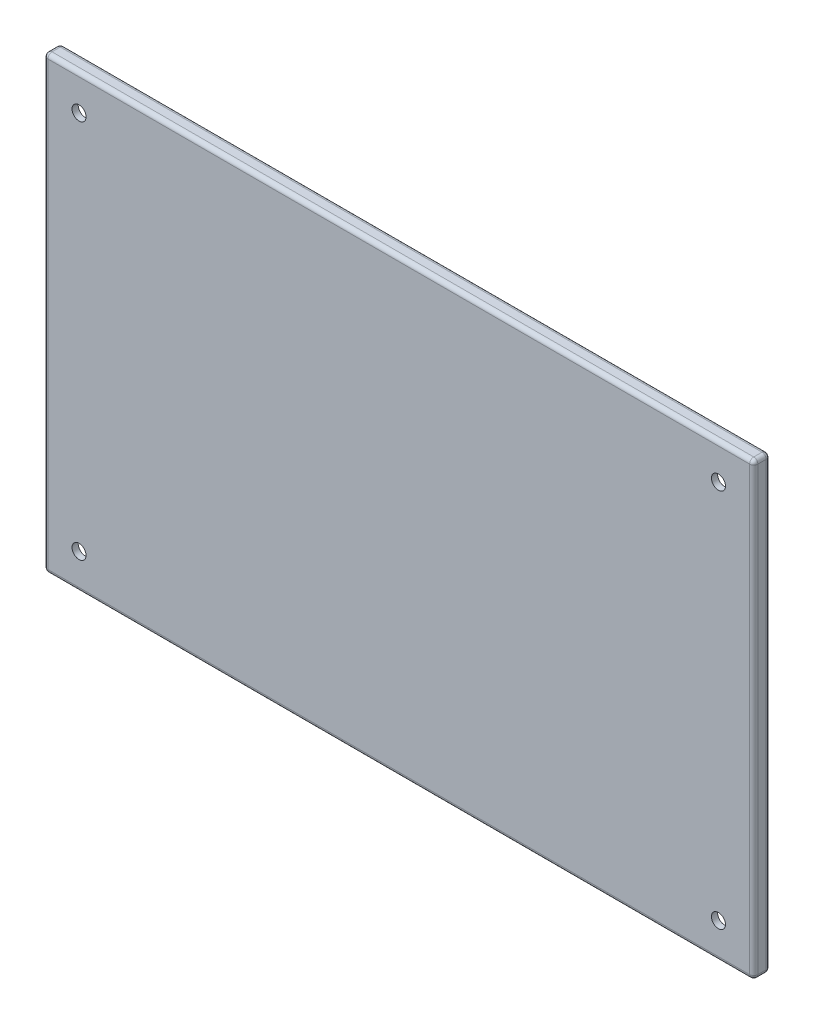
ISO-10303-21;
HEADER;
FILE_DESCRIPTION(('STEP AP214'),'2;1');
FILE_NAME('part.step','',(''),(''),'','','');
FILE_SCHEMA(('AUTOMOTIVE_DESIGN { 1 0 10303 214 1 1 1 1 }'));
ENDSEC;
DATA;
#1=APPLICATION_CONTEXT('core data for automotive mechanical design processes');
#2=APPLICATION_PROTOCOL_DEFINITION('international standard','automotive_design',2000,#1);
#3=PRODUCT_CONTEXT('',#1,'mechanical');
#4=PRODUCT('Part','Part','',(#3));
#5=PRODUCT_RELATED_PRODUCT_CATEGORY('part','',(#4));
#6=PRODUCT_DEFINITION_FORMATION('','',#4);
#7=PRODUCT_DEFINITION_CONTEXT('part definition',#1,'design');
#8=PRODUCT_DEFINITION('design','',#6,#7);
#9=PRODUCT_DEFINITION_SHAPE('','',#8);
#10=(LENGTH_UNIT() NAMED_UNIT(*) SI_UNIT(.MILLI.,.METRE.));
#11=(NAMED_UNIT(*) PLANE_ANGLE_UNIT() SI_UNIT($,.RADIAN.));
#12=(NAMED_UNIT(*) SI_UNIT($,.STERADIAN.) SOLID_ANGLE_UNIT());
#13=UNCERTAINTY_MEASURE_WITH_UNIT(LENGTH_MEASURE(1.E-05),#10,'distance_accuracy_value','');
#14=(GEOMETRIC_REPRESENTATION_CONTEXT(3) GLOBAL_UNCERTAINTY_ASSIGNED_CONTEXT((#13)) GLOBAL_UNIT_ASSIGNED_CONTEXT((#10,
#11,#12)) REPRESENTATION_CONTEXT('',''));
#15=CARTESIAN_POINT('',(0.,0.,0.));
#16=DIRECTION('',(0.,0.,1.));
#17=DIRECTION('',(1.,0.,0.));
#18=AXIS2_PLACEMENT_3D('',#15,#16,#17);
#19=CARTESIAN_POINT('',(0.,0.,1.5));
#20=DIRECTION('',(0.,0.,1.));
#21=DIRECTION('',(1.,0.,0.));
#22=AXIS2_PLACEMENT_3D('',#19,#20,#21);
#23=PLANE('',#22);
#24=DIRECTION('',(-1.,0.,0.));
#25=VECTOR('',#24,1.);
#26=CARTESIAN_POINT('',(0.,53.55,1.5));
#27=LINE('',#26,#25);
#28=CARTESIAN_POINT('',(85.,53.55,1.5));
#29=VERTEX_POINT('',#28);
#30=CARTESIAN_POINT('',(-85.,53.55,1.5));
#31=VERTEX_POINT('',#30);
#32=EDGE_CURVE('E275',#29,#31,#27,.T.);
#33=ORIENTED_EDGE('',*,*,#32,.T.);
#34=DIRECTION('',(0.,-1.,0.));
#35=VECTOR('',#34,1.);
#36=CARTESIAN_POINT('',(-85.,0.,1.5));
#37=LINE('',#36,#35);
#38=CARTESIAN_POINT('',(-85.,-53.55,1.5));
#39=VERTEX_POINT('',#38);
#40=EDGE_CURVE('E284',#31,#39,#37,.T.);
#41=ORIENTED_EDGE('',*,*,#40,.T.);
#42=DIRECTION('',(1.,0.,0.));
#43=VECTOR('',#42,1.);
#44=CARTESIAN_POINT('',(0.,-53.55,1.5));
#45=LINE('',#44,#43);
#46=CARTESIAN_POINT('',(85.,-53.55,1.5));
#47=VERTEX_POINT('',#46);
#48=EDGE_CURVE('E281',#39,#47,#45,.T.);
#49=ORIENTED_EDGE('',*,*,#48,.T.);
#50=DIRECTION('',(0.,1.,0.));
#51=VECTOR('',#50,1.);
#52=CARTESIAN_POINT('',(85.,0.,1.5));
#53=LINE('',#52,#51);
#54=EDGE_CURVE('E278',#47,#29,#53,.T.);
#55=ORIENTED_EDGE('',*,*,#54,.T.);
#56=EDGE_LOOP('',(#33,#41,#49,#55));
#57=FACE_BOUND('',#56,.T.);
#58=CARTESIAN_POINT('',(77.45,-46.,1.5));
#59=DIRECTION('',(0.,0.,1.));
#60=DIRECTION('',(1.,0.,0.));
#61=AXIS2_PLACEMENT_3D('',#58,#59,#60);
#62=CIRCLE('',#61,1.7);
#63=CARTESIAN_POINT('',(79.15,-46.,1.5));
#64=VERTEX_POINT('',#63);
#65=EDGE_CURVE('E216',#64,#64,#62,.T.);
#66=ORIENTED_EDGE('',*,*,#65,.F.);
#67=EDGE_LOOP('',(#66));
#68=FACE_BOUND('',#67,.T.);
#69=CARTESIAN_POINT('',(-77.45,46.,1.5));
#70=DIRECTION('',(0.,0.,1.));
#71=DIRECTION('',(1.,0.,0.));
#72=AXIS2_PLACEMENT_3D('',#69,#70,#71);
#73=CIRCLE('',#72,1.7);
#74=CARTESIAN_POINT('',(-75.75,46.,1.5));
#75=VERTEX_POINT('',#74);
#76=EDGE_CURVE('E232',#75,#75,#73,.T.);
#77=ORIENTED_EDGE('',*,*,#76,.F.);
#78=EDGE_LOOP('',(#77));
#79=FACE_BOUND('',#78,.T.);
#80=CARTESIAN_POINT('',(77.45,46.,1.5));
#81=DIRECTION('',(0.,0.,1.));
#82=DIRECTION('',(-1.,0.,0.));
#83=AXIS2_PLACEMENT_3D('',#80,#81,#82);
#84=CIRCLE('',#83,1.7);
#85=CARTESIAN_POINT('',(75.75,46.,1.5));
#86=VERTEX_POINT('',#85);
#87=EDGE_CURVE('E224',#86,#86,#84,.T.);
#88=ORIENTED_EDGE('',*,*,#87,.F.);
#89=EDGE_LOOP('',(#88));
#90=FACE_BOUND('',#89,.T.);
#91=CARTESIAN_POINT('',(-77.45,-46.,1.5));
#92=DIRECTION('',(0.,0.,1.));
#93=DIRECTION('',(-1.,0.,0.));
#94=AXIS2_PLACEMENT_3D('',#91,#92,#93);
#95=CIRCLE('',#94,1.7);
#96=CARTESIAN_POINT('',(-79.15,-46.,1.5));
#97=VERTEX_POINT('',#96);
#98=EDGE_CURVE('E208',#97,#97,#95,.T.);
#99=ORIENTED_EDGE('',*,*,#98,.F.);
#100=EDGE_LOOP('',(#99));
#101=FACE_BOUND('',#100,.T.);
#102=ADVANCED_FACE('F45',(#57,#68,#79,#90,#101),#23,.T.);
#103=CARTESIAN_POINT('',(0.,0.,0.));
#104=DIRECTION('',(0.,0.,1.));
#105=DIRECTION('',(1.,0.,0.));
#106=AXIS2_PLACEMENT_3D('',#103,#104,#105);
#107=PLANE('',#106);
#108=DIRECTION('',(0.,-1.,0.));
#109=VECTOR('',#108,1.);
#110=CARTESIAN_POINT('',(-82.5,-51.05,0.));
#111=LINE('',#110,#109);
#112=CARTESIAN_POINT('',(-82.5,52.05,0.));
#113=VERTEX_POINT('',#112);
#114=CARTESIAN_POINT('',(-82.5,-51.05,0.));
#115=VERTEX_POINT('',#114);
#116=EDGE_CURVE('E236',#113,#115,#111,.T.);
#117=ORIENTED_EDGE('',*,*,#116,.F.);
#118=DIRECTION('',(1.,0.,0.));
#119=VECTOR('',#118,1.);
#120=CARTESIAN_POINT('',(82.5,52.05,0.));
#121=LINE('',#120,#119);
#122=CARTESIAN_POINT('',(82.5,52.05,0.));
#123=VERTEX_POINT('',#122);
#124=EDGE_CURVE('E182',#113,#123,#121,.T.);
#125=ORIENTED_EDGE('',*,*,#124,.T.);
#126=DIRECTION('',(0.,1.,0.));
#127=VECTOR('',#126,1.);
#128=CARTESIAN_POINT('',(82.5,-51.05,0.));
#129=LINE('',#128,#127);
#130=CARTESIAN_POINT('',(82.5,-51.05,0.));
#131=VERTEX_POINT('',#130);
#132=EDGE_CURVE('E246',#131,#123,#129,.T.);
#133=ORIENTED_EDGE('',*,*,#132,.F.);
#134=DIRECTION('',(1.,0.,0.));
#135=VECTOR('',#134,1.);
#136=CARTESIAN_POINT('',(82.5,-51.05,0.));
#137=LINE('',#136,#135);
#138=EDGE_CURVE('E242',#115,#131,#137,.T.);
#139=ORIENTED_EDGE('',*,*,#138,.F.);
#140=EDGE_LOOP('',(#117,#125,#133,#139));
#141=FACE_BOUND('',#140,.T.);
#142=CARTESIAN_POINT('',(-77.45,46.,0.));
#143=DIRECTION('',(0.,0.,1.));
#144=DIRECTION('',(1.,0.,0.));
#145=AXIS2_PLACEMENT_3D('',#142,#143,#144);
#146=CIRCLE('',#145,1.7);
#147=CARTESIAN_POINT('',(-75.75,46.,0.));
#148=VERTEX_POINT('',#147);
#149=EDGE_CURVE('E228',#148,#148,#146,.T.);
#150=ORIENTED_EDGE('',*,*,#149,.T.);
#151=EDGE_LOOP('',(#150));
#152=FACE_BOUND('',#151,.T.);
#153=CARTESIAN_POINT('',(77.45,46.,0.));
#154=DIRECTION('',(0.,0.,1.));
#155=DIRECTION('',(-1.,0.,0.));
#156=AXIS2_PLACEMENT_3D('',#153,#154,#155);
#157=CIRCLE('',#156,1.7);
#158=CARTESIAN_POINT('',(75.75,46.,0.));
#159=VERTEX_POINT('',#158);
#160=EDGE_CURVE('E220',#159,#159,#157,.T.);
#161=ORIENTED_EDGE('',*,*,#160,.T.);
#162=EDGE_LOOP('',(#161));
#163=FACE_BOUND('',#162,.T.);
#164=CARTESIAN_POINT('',(77.45,-46.,0.));
#165=DIRECTION('',(0.,0.,1.));
#166=DIRECTION('',(1.,0.,0.));
#167=AXIS2_PLACEMENT_3D('',#164,#165,#166);
#168=CIRCLE('',#167,1.7);
#169=CARTESIAN_POINT('',(79.15,-46.,0.));
#170=VERTEX_POINT('',#169);
#171=EDGE_CURVE('E212',#170,#170,#168,.T.);
#172=ORIENTED_EDGE('',*,*,#171,.T.);
#173=EDGE_LOOP('',(#172));
#174=FACE_BOUND('',#173,.T.);
#175=CARTESIAN_POINT('',(-77.45,-46.,0.));
#176=DIRECTION('',(0.,0.,1.));
#177=DIRECTION('',(-1.,0.,0.));
#178=AXIS2_PLACEMENT_3D('',#175,#176,#177);
#179=CIRCLE('',#178,1.7);
#180=CARTESIAN_POINT('',(-79.15,-46.,0.));
#181=VERTEX_POINT('',#180);
#182=EDGE_CURVE('E205',#181,#181,#179,.T.);
#183=ORIENTED_EDGE('',*,*,#182,.T.);
#184=EDGE_LOOP('',(#183));
#185=FACE_BOUND('',#184,.T.);
#186=ADVANCED_FACE('F495',(#141,#152,#163,#174,#185),#107,.F.);
#187=CARTESIAN_POINT('',(-77.45,46.,1.5));
#188=DIRECTION('',(0.,0.,-1.));
#189=DIRECTION('',(-1.,0.,0.));
#190=AXIS2_PLACEMENT_3D('',#187,#188,#189);
#191=CYLINDRICAL_SURFACE('',#190,1.7);
#192=ORIENTED_EDGE('',*,*,#76,.T.);
#193=EDGE_LOOP('',(#192));
#194=FACE_BOUND('',#193,.T.);
#195=ORIENTED_EDGE('',*,*,#149,.F.);
#196=EDGE_LOOP('',(#195));
#197=FACE_BOUND('',#196,.T.);
#198=ADVANCED_FACE('F502',(#194,#197),#191,.F.);
#199=CARTESIAN_POINT('',(77.45,46.,1.5));
#200=DIRECTION('',(0.,0.,-1.));
#201=DIRECTION('',(-1.,0.,0.));
#202=AXIS2_PLACEMENT_3D('',#199,#200,#201);
#203=CYLINDRICAL_SURFACE('',#202,1.7);
#204=ORIENTED_EDGE('',*,*,#87,.T.);
#205=EDGE_LOOP('',(#204));
#206=FACE_BOUND('',#205,.T.);
#207=ORIENTED_EDGE('',*,*,#160,.F.);
#208=EDGE_LOOP('',(#207));
#209=FACE_BOUND('',#208,.T.);
#210=ADVANCED_FACE('F740',(#206,#209),#203,.F.);
#211=CARTESIAN_POINT('',(77.45,-46.,1.5));
#212=DIRECTION('',(0.,0.,-1.));
#213=DIRECTION('',(-1.,0.,0.));
#214=AXIS2_PLACEMENT_3D('',#211,#212,#213);
#215=CYLINDRICAL_SURFACE('',#214,1.7);
#216=ORIENTED_EDGE('',*,*,#65,.T.);
#217=EDGE_LOOP('',(#216));
#218=FACE_BOUND('',#217,.T.);
#219=ORIENTED_EDGE('',*,*,#171,.F.);
#220=EDGE_LOOP('',(#219));
#221=FACE_BOUND('',#220,.T.);
#222=ADVANCED_FACE('F731',(#218,#221),#215,.F.);
#223=CARTESIAN_POINT('',(-77.45,-46.,1.5));
#224=DIRECTION('',(0.,0.,-1.));
#225=DIRECTION('',(-1.,0.,0.));
#226=AXIS2_PLACEMENT_3D('',#223,#224,#225);
#227=CYLINDRICAL_SURFACE('',#226,1.7);
#228=ORIENTED_EDGE('',*,*,#98,.T.);
#229=EDGE_LOOP('',(#228));
#230=FACE_BOUND('',#229,.T.);
#231=ORIENTED_EDGE('',*,*,#182,.F.);
#232=EDGE_LOOP('',(#231));
#233=FACE_BOUND('',#232,.T.);
#234=ADVANCED_FACE('F722',(#230,#233),#227,.F.);
#235=CARTESIAN_POINT('',(-82.5,-51.05,-2.5));
#236=DIRECTION('',(0.,-1.,0.));
#237=DIRECTION('',(0.,0.,-1.));
#238=AXIS2_PLACEMENT_3D('',#235,#236,#237);
#239=PLANE('',#238);
#240=DIRECTION('',(0.,0.,1.));
#241=VECTOR('',#240,1.);
#242=CARTESIAN_POINT('',(-82.5,-51.05,-2.5));
#243=LINE('',#242,#241);
#244=CARTESIAN_POINT('',(-82.5,-51.05,-2.5));
#245=VERTEX_POINT('',#244);
#246=EDGE_CURVE('E165',#245,#115,#243,.T.);
#247=ORIENTED_EDGE('',*,*,#246,.T.);
#248=ORIENTED_EDGE('',*,*,#138,.T.);
#249=DIRECTION('',(0.,0.,1.));
#250=VECTOR('',#249,1.);
#251=CARTESIAN_POINT('',(82.5,-51.05,-2.5));
#252=LINE('',#251,#250);
#253=CARTESIAN_POINT('',(82.5,-51.05,-2.5));
#254=VERTEX_POINT('',#253);
#255=EDGE_CURVE('E201',#254,#131,#252,.T.);
#256=ORIENTED_EDGE('',*,*,#255,.F.);
#257=DIRECTION('',(1.,0.,0.));
#258=VECTOR('',#257,1.);
#259=CARTESIAN_POINT('',(-82.5,-51.05,-2.5));
#260=LINE('',#259,#258);
#261=EDGE_CURVE('E171',#245,#254,#260,.T.);
#262=ORIENTED_EDGE('',*,*,#261,.F.);
#263=EDGE_LOOP('',(#247,#248,#256,#262));
#264=FACE_BOUND('',#263,.T.);
#265=ADVANCED_FACE('F713',(#264),#239,.F.);
#266=CARTESIAN_POINT('',(-82.5,51.05,-2.5));
#267=DIRECTION('',(-1.,0.,0.));
#268=DIRECTION('',(0.,-1.,0.));
#269=AXIS2_PLACEMENT_3D('',#266,#267,#268);
#270=PLANE('',#269);
#271=DIRECTION('',(0.,-1.,0.));
#272=VECTOR('',#271,1.);
#273=CARTESIAN_POINT('',(-82.5,51.05,-2.5));
#274=LINE('',#273,#272);
#275=CARTESIAN_POINT('',(-82.5,52.05,-2.5));
#276=VERTEX_POINT('',#275);
#277=EDGE_CURVE('E159',#276,#245,#274,.T.);
#278=ORIENTED_EDGE('',*,*,#277,.F.);
#279=DIRECTION('',(0.,0.,-1.));
#280=VECTOR('',#279,1.);
#281=CARTESIAN_POINT('',(-82.5,52.05,165.003030275204));
#282=LINE('',#281,#280);
#283=EDGE_CURVE('E163',#113,#276,#282,.T.);
#284=ORIENTED_EDGE('',*,*,#283,.F.);
#285=ORIENTED_EDGE('',*,*,#116,.T.);
#286=ORIENTED_EDGE('',*,*,#246,.F.);
#287=EDGE_LOOP('',(#278,#284,#285,#286));
#288=FACE_BOUND('',#287,.T.);
#289=ADVANCED_FACE('F161',(#288),#270,.F.);
#290=CARTESIAN_POINT('',(82.5,51.05,-2.5));
#291=DIRECTION('',(1.,0.,0.));
#292=DIRECTION('',(0.,0.,-1.));
#293=AXIS2_PLACEMENT_3D('',#290,#291,#292);
#294=PLANE('',#293);
#295=ORIENTED_EDGE('',*,*,#255,.T.);
#296=ORIENTED_EDGE('',*,*,#132,.T.);
#297=DIRECTION('',(0.,0.,-1.));
#298=VECTOR('',#297,1.);
#299=CARTESIAN_POINT('',(82.5,52.05,165.003030275204));
#300=LINE('',#299,#298);
#301=CARTESIAN_POINT('',(82.5,52.05,-2.5));
#302=VERTEX_POINT('',#301);
#303=EDGE_CURVE('E172',#123,#302,#300,.T.);
#304=ORIENTED_EDGE('',*,*,#303,.T.);
#305=DIRECTION('',(0.,1.,0.));
#306=VECTOR('',#305,1.);
#307=CARTESIAN_POINT('',(82.5,51.05,-2.5));
#308=LINE('',#307,#306);
#309=EDGE_CURVE('E186',#254,#302,#308,.T.);
#310=ORIENTED_EDGE('',*,*,#309,.F.);
#311=EDGE_LOOP('',(#295,#296,#304,#310));
#312=FACE_BOUND('',#311,.T.);
#313=ADVANCED_FACE('F696',(#312),#294,.F.);
#314=CARTESIAN_POINT('',(-86.,54.55,-2.5));
#315=DIRECTION('',(-1.,0.,0.));
#316=DIRECTION('',(0.,-1.,0.));
#317=AXIS2_PLACEMENT_3D('',#314,#315,#316);
#318=PLANE('',#317);
#319=DIRECTION('',(0.,-1.,0.));
#320=VECTOR('',#319,1.);
#321=CARTESIAN_POINT('',(-86.,-54.55,-1.5));
#322=LINE('',#321,#320);
#323=CARTESIAN_POINT('',(-86.,53.55,-1.5));
#324=VERTEX_POINT('',#323);
#325=CARTESIAN_POINT('',(-86.,-53.55,-1.5));
#326=VERTEX_POINT('',#325);
#327=EDGE_CURVE('E255',#324,#326,#322,.T.);
#328=ORIENTED_EDGE('',*,*,#327,.T.);
#329=DIRECTION('',(0.,0.,1.));
#330=VECTOR('',#329,1.);
#331=CARTESIAN_POINT('',(-86.,-53.55,-2.5));
#332=LINE('',#331,#330);
#333=CARTESIAN_POINT('',(-86.,-53.55,0.5));
#334=VERTEX_POINT('',#333);
#335=EDGE_CURVE('E259',#326,#334,#332,.T.);
#336=ORIENTED_EDGE('',*,*,#335,.T.);
#337=DIRECTION('',(0.,-1.,0.));
#338=VECTOR('',#337,1.);
#339=CARTESIAN_POINT('',(-86.,54.55,0.5));
#340=LINE('',#339,#338);
#341=CARTESIAN_POINT('',(-86.,53.55,0.5));
#342=VERTEX_POINT('',#341);
#343=EDGE_CURVE('E252',#334,#342,#340,.F.);
#344=ORIENTED_EDGE('',*,*,#343,.T.);
#345=DIRECTION('',(0.,0.,1.));
#346=VECTOR('',#345,1.);
#347=CARTESIAN_POINT('',(-86.,53.55,-2.5));
#348=LINE('',#347,#346);
#349=EDGE_CURVE('E249',#342,#324,#348,.F.);
#350=ORIENTED_EDGE('',*,*,#349,.T.);
#351=EDGE_LOOP('',(#328,#336,#344,#350));
#352=FACE_BOUND('',#351,.T.);
#353=ADVANCED_FACE('F689',(#352),#318,.T.);
#354=CARTESIAN_POINT('',(-86.,54.55,-2.5));
#355=DIRECTION('',(0.,1.,0.));
#356=DIRECTION('',(0.,0.,1.));
#357=AXIS2_PLACEMENT_3D('',#354,#355,#356);
#358=PLANE('',#357);
#359=DIRECTION('',(-1.,0.,0.));
#360=VECTOR('',#359,1.);
#361=CARTESIAN_POINT('',(-86.,54.55,-1.5));
#362=LINE('',#361,#360);
#363=CARTESIAN_POINT('',(85.,54.55,-1.5));
#364=VERTEX_POINT('',#363);
#365=CARTESIAN_POINT('',(-85.,54.55,-1.5));
#366=VERTEX_POINT('',#365);
#367=EDGE_CURVE('E55',#364,#366,#362,.T.);
#368=ORIENTED_EDGE('',*,*,#367,.T.);
#369=DIRECTION('',(0.,0.,1.));
#370=VECTOR('',#369,1.);
#371=CARTESIAN_POINT('',(-85.,54.55,-2.5));
#372=LINE('',#371,#370);
#373=CARTESIAN_POINT('',(-85.,54.55,0.5));
#374=VERTEX_POINT('',#373);
#375=EDGE_CURVE('E11',#366,#374,#372,.T.);
#376=ORIENTED_EDGE('',*,*,#375,.T.);
#377=DIRECTION('',(-1.,0.,0.));
#378=VECTOR('',#377,1.);
#379=CARTESIAN_POINT('',(-86.,54.55,0.5));
#380=LINE('',#379,#378);
#381=CARTESIAN_POINT('',(85.,54.55,0.5));
#382=VERTEX_POINT('',#381);
#383=EDGE_CURVE('E314',#374,#382,#380,.F.);
#384=ORIENTED_EDGE('',*,*,#383,.T.);
#385=DIRECTION('',(0.,0.,1.));
#386=VECTOR('',#385,1.);
#387=CARTESIAN_POINT('',(85.,54.55,-2.5));
#388=LINE('',#387,#386);
#389=EDGE_CURVE('E66',#382,#364,#388,.F.);
#390=ORIENTED_EDGE('',*,*,#389,.T.);
#391=EDGE_LOOP('',(#368,#376,#384,#390));
#392=FACE_BOUND('',#391,.T.);
#393=ADVANCED_FACE('F681',(#392),#358,.T.);
#394=CARTESIAN_POINT('',(86.,54.55,-2.5));
#395=DIRECTION('',(1.,0.,0.));
#396=DIRECTION('',(0.,0.,-1.));
#397=AXIS2_PLACEMENT_3D('',#394,#395,#396);
#398=PLANE('',#397);
#399=DIRECTION('',(0.,0.,1.));
#400=VECTOR('',#399,1.);
#401=CARTESIAN_POINT('',(86.,-53.55,-2.5));
#402=LINE('',#401,#400);
#403=CARTESIAN_POINT('',(86.,-53.55,0.5));
#404=VERTEX_POINT('',#403);
#405=CARTESIAN_POINT('',(86.,-53.55,-1.5));
#406=VERTEX_POINT('',#405);
#407=EDGE_CURVE('E307',#404,#406,#402,.F.);
#408=ORIENTED_EDGE('',*,*,#407,.T.);
#409=DIRECTION('',(0.,1.,0.));
#410=VECTOR('',#409,1.);
#411=CARTESIAN_POINT('',(86.,54.55,-1.5));
#412=LINE('',#411,#410);
#413=CARTESIAN_POINT('',(86.,53.55,-1.5));
#414=VERTEX_POINT('',#413);
#415=EDGE_CURVE('E310',#406,#414,#412,.T.);
#416=ORIENTED_EDGE('',*,*,#415,.T.);
#417=DIRECTION('',(0.,0.,1.));
#418=VECTOR('',#417,1.);
#419=CARTESIAN_POINT('',(86.,53.55,-2.5));
#420=LINE('',#419,#418);
#421=CARTESIAN_POINT('',(86.,53.55,0.5));
#422=VERTEX_POINT('',#421);
#423=EDGE_CURVE('E301',#414,#422,#420,.T.);
#424=ORIENTED_EDGE('',*,*,#423,.T.);
#425=DIRECTION('',(0.,1.,0.));
#426=VECTOR('',#425,1.);
#427=CARTESIAN_POINT('',(86.,54.55,0.5));
#428=LINE('',#427,#426);
#429=EDGE_CURVE('E304',#422,#404,#428,.F.);
#430=ORIENTED_EDGE('',*,*,#429,.T.);
#431=EDGE_LOOP('',(#408,#416,#424,#430));
#432=FACE_BOUND('',#431,.T.);
#433=ADVANCED_FACE('F429',(#432),#398,.T.);
#434=CARTESIAN_POINT('',(-86.,-54.55,-2.5));
#435=DIRECTION('',(0.,-1.,0.));
#436=DIRECTION('',(0.,0.,-1.));
#437=AXIS2_PLACEMENT_3D('',#434,#435,#436);
#438=PLANE('',#437);
#439=DIRECTION('',(0.,0.,1.));
#440=VECTOR('',#439,1.);
#441=CARTESIAN_POINT('',(-85.,-54.55,-2.5));
#442=LINE('',#441,#440);
#443=CARTESIAN_POINT('',(-85.,-54.55,0.5));
#444=VERTEX_POINT('',#443);
#445=CARTESIAN_POINT('',(-85.,-54.55,-1.5));
#446=VERTEX_POINT('',#445);
#447=EDGE_CURVE('E294',#444,#446,#442,.F.);
#448=ORIENTED_EDGE('',*,*,#447,.T.);
#449=DIRECTION('',(1.,0.,0.));
#450=VECTOR('',#449,1.);
#451=CARTESIAN_POINT('',(86.,-54.55,-1.5));
#452=LINE('',#451,#450);
#453=CARTESIAN_POINT('',(85.,-54.55,-1.5));
#454=VERTEX_POINT('',#453);
#455=EDGE_CURVE('E297',#446,#454,#452,.T.);
#456=ORIENTED_EDGE('',*,*,#455,.T.);
#457=DIRECTION('',(0.,0.,1.));
#458=VECTOR('',#457,1.);
#459=CARTESIAN_POINT('',(85.,-54.55,-2.5));
#460=LINE('',#459,#458);
#461=CARTESIAN_POINT('',(85.,-54.55,0.5));
#462=VERTEX_POINT('',#461);
#463=EDGE_CURVE('E288',#454,#462,#460,.T.);
#464=ORIENTED_EDGE('',*,*,#463,.T.);
#465=DIRECTION('',(1.,0.,0.));
#466=VECTOR('',#465,1.);
#467=CARTESIAN_POINT('',(-86.,-54.55,0.5));
#468=LINE('',#467,#466);
#469=EDGE_CURVE('E291',#462,#444,#468,.F.);
#470=ORIENTED_EDGE('',*,*,#469,.T.);
#471=EDGE_LOOP('',(#448,#456,#464,#470));
#472=FACE_BOUND('',#471,.T.);
#473=ADVANCED_FACE('F420',(#472),#438,.T.);
#474=CARTESIAN_POINT('',(0.,0.,-2.5));
#475=DIRECTION('',(0.,0.,1.));
#476=DIRECTION('',(1.,0.,0.));
#477=AXIS2_PLACEMENT_3D('',#474,#475,#476);
#478=PLANE('',#477);
#479=DIRECTION('',(1.,0.,0.));
#480=VECTOR('',#479,1.);
#481=CARTESIAN_POINT('',(-86.,-53.55,-2.5));
#482=LINE('',#481,#480);
#483=CARTESIAN_POINT('',(85.,-53.55,-2.5));
#484=VERTEX_POINT('',#483);
#485=CARTESIAN_POINT('',(-85.,-53.55,-2.5));
#486=VERTEX_POINT('',#485);
#487=EDGE_CURVE('E268',#484,#486,#482,.F.);
#488=ORIENTED_EDGE('',*,*,#487,.T.);
#489=DIRECTION('',(0.,-1.,0.));
#490=VECTOR('',#489,1.);
#491=CARTESIAN_POINT('',(-85.,54.55,-2.5));
#492=LINE('',#491,#490);
#493=CARTESIAN_POINT('',(-85.,53.55,-2.5));
#494=VERTEX_POINT('',#493);
#495=EDGE_CURVE('E271',#486,#494,#492,.F.);
#496=ORIENTED_EDGE('',*,*,#495,.T.);
#497=DIRECTION('',(-1.,0.,0.));
#498=VECTOR('',#497,1.);
#499=CARTESIAN_POINT('',(86.,53.55,-2.5));
#500=LINE('',#499,#498);
#501=CARTESIAN_POINT('',(85.,53.55,-2.5));
#502=VERTEX_POINT('',#501);
#503=EDGE_CURVE('E262',#494,#502,#500,.F.);
#504=ORIENTED_EDGE('',*,*,#503,.T.);
#505=DIRECTION('',(0.,1.,0.));
#506=VECTOR('',#505,1.);
#507=CARTESIAN_POINT('',(85.,-54.55,-2.5));
#508=LINE('',#507,#506);
#509=EDGE_CURVE('E265',#502,#484,#508,.F.);
#510=ORIENTED_EDGE('',*,*,#509,.T.);
#511=EDGE_LOOP('',(#488,#496,#504,#510));
#512=FACE_BOUND('',#511,.T.);
#513=DIRECTION('',(1.,0.,0.));
#514=VECTOR('',#513,1.);
#515=CARTESIAN_POINT('',(82.5,52.05,-2.5));
#516=LINE('',#515,#514);
#517=EDGE_CURVE('E179',#276,#302,#516,.T.);
#518=ORIENTED_EDGE('',*,*,#517,.F.);
#519=ORIENTED_EDGE('',*,*,#277,.T.);
#520=ORIENTED_EDGE('',*,*,#261,.T.);
#521=ORIENTED_EDGE('',*,*,#309,.T.);
#522=EDGE_LOOP('',(#518,#519,#520,#521));
#523=FACE_BOUND('',#522,.T.);
#524=ADVANCED_FACE('F185',(#512,#523),#478,.F.);
#525=CARTESIAN_POINT('',(82.5,52.05,165.003030275204));
#526=DIRECTION('',(0.,1.,0.));
#527=DIRECTION('',(0.,0.,1.));
#528=AXIS2_PLACEMENT_3D('',#525,#526,#527);
#529=PLANE('',#528);
#530=ORIENTED_EDGE('',*,*,#283,.T.);
#531=ORIENTED_EDGE('',*,*,#517,.T.);
#532=ORIENTED_EDGE('',*,*,#303,.F.);
#533=ORIENTED_EDGE('',*,*,#124,.F.);
#534=EDGE_LOOP('',(#530,#531,#532,#533));
#535=FACE_BOUND('',#534,.T.);
#536=ADVANCED_FACE('F177',(#535),#529,.F.);
#537=CARTESIAN_POINT('',(85.,0.,0.5));
#538=DIRECTION('',(0.,1.,0.));
#539=DIRECTION('',(0.,0.,1.));
#540=AXIS2_PLACEMENT_3D('',#537,#538,#539);
#541=CYLINDRICAL_SURFACE('',#540,1.);
#542=CARTESIAN_POINT('',(85.,53.55,0.5));
#543=DIRECTION('',(0.,1.,0.));
#544=DIRECTION('',(0.,0.,1.));
#545=AXIS2_PLACEMENT_3D('',#542,#543,#544);
#546=CIRCLE('',#545,1.);
#547=EDGE_CURVE('E49',#29,#422,#546,.T.);
#548=ORIENTED_EDGE('',*,*,#547,.F.);
#549=ORIENTED_EDGE('',*,*,#54,.F.);
#550=CARTESIAN_POINT('',(85.,-53.55,0.5));
#551=DIRECTION('',(0.,-1.,0.));
#552=DIRECTION('',(0.,0.,-1.));
#553=AXIS2_PLACEMENT_3D('',#550,#551,#552);
#554=CIRCLE('',#553,1.);
#555=EDGE_CURVE('E191',#404,#47,#554,.T.);
#556=ORIENTED_EDGE('',*,*,#555,.F.);
#557=ORIENTED_EDGE('',*,*,#429,.F.);
#558=EDGE_LOOP('',(#548,#549,#556,#557));
#559=FACE_BOUND('',#558,.T.);
#560=ADVANCED_FACE('F47',(#559),#541,.T.);
#561=CARTESIAN_POINT('',(85.,53.55,0.5));
#562=DIRECTION('',(1.,0.,0.));
#563=DIRECTION('',(0.,0.,-1.));
#564=AXIS2_PLACEMENT_3D('',#561,#562,#563);
#565=SPHERICAL_SURFACE('',#564,1.);
#566=CARTESIAN_POINT('',(85.,53.55,0.5));
#567=DIRECTION('',(1.,0.,0.));
#568=DIRECTION('',(0.,0.,-1.));
#569=AXIS2_PLACEMENT_3D('',#566,#567,#568);
#570=CIRCLE('',#569,1.);
#571=EDGE_CURVE('E395',#29,#382,#570,.F.);
#572=ORIENTED_EDGE('',*,*,#571,.F.);
#573=ORIENTED_EDGE('',*,*,#547,.T.);
#574=CARTESIAN_POINT('',(85.,53.55,0.5));
#575=DIRECTION('',(0.,0.,1.));
#576=DIRECTION('',(1.,0.,0.));
#577=AXIS2_PLACEMENT_3D('',#574,#575,#576);
#578=CIRCLE('',#577,1.);
#579=EDGE_CURVE('E399',#382,#422,#578,.F.);
#580=ORIENTED_EDGE('',*,*,#579,.F.);
#581=EDGE_LOOP('',(#572,#573,#580));
#582=FACE_BOUND('',#581,.T.);
#583=ADVANCED_FACE('F445',(#582),#565,.T.);
#584=CARTESIAN_POINT('',(85.,-53.55,0.5));
#585=DIRECTION('',(0.,0.,1.));
#586=DIRECTION('',(1.,0.,0.));
#587=AXIS2_PLACEMENT_3D('',#584,#585,#586);
#588=SPHERICAL_SURFACE('',#587,1.);
#589=CARTESIAN_POINT('',(85.,-53.55,0.5));
#590=DIRECTION('',(0.,0.,1.));
#591=DIRECTION('',(1.,0.,0.));
#592=AXIS2_PLACEMENT_3D('',#589,#590,#591);
#593=CIRCLE('',#592,1.);
#594=EDGE_CURVE('E387',#404,#462,#593,.F.);
#595=ORIENTED_EDGE('',*,*,#594,.F.);
#596=ORIENTED_EDGE('',*,*,#555,.T.);
#597=CARTESIAN_POINT('',(85.,-53.55,0.5));
#598=DIRECTION('',(1.,0.,0.));
#599=DIRECTION('',(0.,0.,-1.));
#600=AXIS2_PLACEMENT_3D('',#597,#598,#599);
#601=CIRCLE('',#600,1.);
#602=EDGE_CURVE('E391',#462,#47,#601,.F.);
#603=ORIENTED_EDGE('',*,*,#602,.F.);
#604=EDGE_LOOP('',(#595,#596,#603));
#605=FACE_BOUND('',#604,.T.);
#606=ADVANCED_FACE('F408',(#605),#588,.T.);
#607=CARTESIAN_POINT('',(85.,53.55,-2.5));
#608=DIRECTION('',(0.,0.,1.));
#609=DIRECTION('',(1.,0.,0.));
#610=AXIS2_PLACEMENT_3D('',#607,#608,#609);
#611=CYLINDRICAL_SURFACE('',#610,1.);
#612=ORIENTED_EDGE('',*,*,#579,.T.);
#613=ORIENTED_EDGE('',*,*,#423,.F.);
#614=CARTESIAN_POINT('',(85.,53.55,-1.5));
#615=DIRECTION('',(0.,0.,-1.));
#616=DIRECTION('',(-1.,0.,0.));
#617=AXIS2_PLACEMENT_3D('',#614,#615,#616);
#618=CIRCLE('',#617,1.);
#619=EDGE_CURVE('E380',#364,#414,#618,.T.);
#620=ORIENTED_EDGE('',*,*,#619,.F.);
#621=ORIENTED_EDGE('',*,*,#389,.F.);
#622=EDGE_LOOP('',(#612,#613,#620,#621));
#623=FACE_BOUND('',#622,.T.);
#624=ADVANCED_FACE('F440',(#623),#611,.T.);
#625=CARTESIAN_POINT('',(0.,53.55,0.5));
#626=DIRECTION('',(-1.,0.,0.));
#627=DIRECTION('',(0.,0.,1.));
#628=AXIS2_PLACEMENT_3D('',#625,#626,#627);
#629=CYLINDRICAL_SURFACE('',#628,1.);
#630=ORIENTED_EDGE('',*,*,#571,.T.);
#631=ORIENTED_EDGE('',*,*,#383,.F.);
#632=CARTESIAN_POINT('',(-85.,53.55,0.5));
#633=DIRECTION('',(-1.,0.,0.));
#634=DIRECTION('',(0.,0.,1.));
#635=AXIS2_PLACEMENT_3D('',#632,#633,#634);
#636=CIRCLE('',#635,1.);
#637=EDGE_CURVE('E376',#31,#374,#636,.T.);
#638=ORIENTED_EDGE('',*,*,#637,.F.);
#639=ORIENTED_EDGE('',*,*,#32,.F.);
#640=EDGE_LOOP('',(#630,#631,#638,#639));
#641=FACE_BOUND('',#640,.T.);
#642=ADVANCED_FACE('F450',(#641),#629,.T.);
#643=CARTESIAN_POINT('',(-85.,0.,0.5));
#644=DIRECTION('',(0.,-1.,0.));
#645=DIRECTION('',(1.,0.,0.));
#646=AXIS2_PLACEMENT_3D('',#643,#644,#645);
#647=CYLINDRICAL_SURFACE('',#646,1.);
#648=CARTESIAN_POINT('',(-85.,-53.55,0.5));
#649=DIRECTION('',(0.,-1.,0.));
#650=DIRECTION('',(0.,0.,-1.));
#651=AXIS2_PLACEMENT_3D('',#648,#649,#650);
#652=CIRCLE('',#651,1.);
#653=EDGE_CURVE('E368',#39,#334,#652,.T.);
#654=ORIENTED_EDGE('',*,*,#653,.F.);
#655=ORIENTED_EDGE('',*,*,#40,.F.);
#656=CARTESIAN_POINT('',(-85.,53.55,0.5));
#657=DIRECTION('',(0.,1.,0.));
#658=DIRECTION('',(0.,0.,1.));
#659=AXIS2_PLACEMENT_3D('',#656,#657,#658);
#660=CIRCLE('',#659,1.);
#661=EDGE_CURVE('E372',#342,#31,#660,.T.);
#662=ORIENTED_EDGE('',*,*,#661,.F.);
#663=ORIENTED_EDGE('',*,*,#343,.F.);
#664=EDGE_LOOP('',(#654,#655,#662,#663));
#665=FACE_BOUND('',#664,.T.);
#666=ADVANCED_FACE('F457',(#665),#647,.T.);
#667=CARTESIAN_POINT('',(0.,-53.55,0.5));
#668=DIRECTION('',(1.,0.,0.));
#669=DIRECTION('',(0.,0.,-1.));
#670=AXIS2_PLACEMENT_3D('',#667,#668,#669);
#671=CYLINDRICAL_SURFACE('',#670,1.);
#672=ORIENTED_EDGE('',*,*,#602,.T.);
#673=ORIENTED_EDGE('',*,*,#48,.F.);
#674=CARTESIAN_POINT('',(-85.,-53.55,0.5));
#675=DIRECTION('',(-1.,0.,0.));
#676=DIRECTION('',(0.,0.,1.));
#677=AXIS2_PLACEMENT_3D('',#674,#675,#676);
#678=CIRCLE('',#677,1.);
#679=EDGE_CURVE('E365',#444,#39,#678,.T.);
#680=ORIENTED_EDGE('',*,*,#679,.F.);
#681=ORIENTED_EDGE('',*,*,#469,.F.);
#682=EDGE_LOOP('',(#672,#673,#680,#681));
#683=FACE_BOUND('',#682,.T.);
#684=ADVANCED_FACE('F416',(#683),#671,.T.);
#685=CARTESIAN_POINT('',(85.,-53.55,-2.5));
#686=DIRECTION('',(0.,0.,1.));
#687=DIRECTION('',(1.,0.,0.));
#688=AXIS2_PLACEMENT_3D('',#685,#686,#687);
#689=CYLINDRICAL_SURFACE('',#688,1.);
#690=ORIENTED_EDGE('',*,*,#594,.T.);
#691=ORIENTED_EDGE('',*,*,#463,.F.);
#692=CARTESIAN_POINT('',(85.,-53.55,-1.5));
#693=DIRECTION('',(0.,0.,-1.));
#694=DIRECTION('',(-1.,0.,0.));
#695=AXIS2_PLACEMENT_3D('',#692,#693,#694);
#696=CIRCLE('',#695,1.);
#697=EDGE_CURVE('E361',#406,#454,#696,.T.);
#698=ORIENTED_EDGE('',*,*,#697,.F.);
#699=ORIENTED_EDGE('',*,*,#407,.F.);
#700=EDGE_LOOP('',(#690,#691,#698,#699));
#701=FACE_BOUND('',#700,.T.);
#702=ADVANCED_FACE('F426',(#701),#689,.T.);
#703=CARTESIAN_POINT('',(85.,54.55,-1.5));
#704=DIRECTION('',(0.,-1.,0.));
#705=DIRECTION('',(0.,0.,-1.));
#706=AXIS2_PLACEMENT_3D('',#703,#704,#705);
#707=CYLINDRICAL_SURFACE('',#706,1.);
#708=CARTESIAN_POINT('',(85.,53.55,-1.5));
#709=DIRECTION('',(0.,1.,0.));
#710=DIRECTION('',(0.,0.,1.));
#711=AXIS2_PLACEMENT_3D('',#708,#709,#710);
#712=CIRCLE('',#711,1.);
#713=EDGE_CURVE('E383',#414,#502,#712,.T.);
#714=ORIENTED_EDGE('',*,*,#713,.F.);
#715=ORIENTED_EDGE('',*,*,#415,.F.);
#716=CARTESIAN_POINT('',(85.,-53.55,-1.5));
#717=DIRECTION('',(0.,-1.,0.));
#718=DIRECTION('',(0.,0.,-1.));
#719=AXIS2_PLACEMENT_3D('',#716,#717,#718);
#720=CIRCLE('',#719,1.);
#721=EDGE_CURVE('E357',#484,#406,#720,.T.);
#722=ORIENTED_EDGE('',*,*,#721,.F.);
#723=ORIENTED_EDGE('',*,*,#509,.F.);
#724=EDGE_LOOP('',(#714,#715,#722,#723));
#725=FACE_BOUND('',#724,.T.);
#726=ADVANCED_FACE('F433',(#725),#707,.T.);
#727=CARTESIAN_POINT('',(85.,53.55,-1.5));
#728=DIRECTION('',(1.,0.,0.));
#729=DIRECTION('',(0.,0.,-1.));
#730=AXIS2_PLACEMENT_3D('',#727,#728,#729);
#731=SPHERICAL_SURFACE('',#730,1.);
#732=ORIENTED_EDGE('',*,*,#619,.T.);
#733=ORIENTED_EDGE('',*,*,#713,.T.);
#734=CARTESIAN_POINT('',(85.,53.55,-1.5));
#735=DIRECTION('',(1.,0.,0.));
#736=DIRECTION('',(0.,0.,-1.));
#737=AXIS2_PLACEMENT_3D('',#734,#735,#736);
#738=CIRCLE('',#737,1.);
#739=EDGE_CURVE('E353',#364,#502,#738,.F.);
#740=ORIENTED_EDGE('',*,*,#739,.F.);
#741=EDGE_LOOP('',(#732,#733,#740));
#742=FACE_BOUND('',#741,.T.);
#743=ADVANCED_FACE('F483',(#742),#731,.T.);
#744=CARTESIAN_POINT('',(-85.,53.55,0.5));
#745=DIRECTION('',(0.,0.,1.));
#746=DIRECTION('',(1.,0.,0.));
#747=AXIS2_PLACEMENT_3D('',#744,#745,#746);
#748=SPHERICAL_SURFACE('',#747,1.);
#749=ORIENTED_EDGE('',*,*,#661,.T.);
#750=ORIENTED_EDGE('',*,*,#637,.T.);
#751=CARTESIAN_POINT('',(-85.,53.55,0.5));
#752=DIRECTION('',(0.,0.,1.));
#753=DIRECTION('',(1.,0.,0.));
#754=AXIS2_PLACEMENT_3D('',#751,#752,#753);
#755=CIRCLE('',#754,1.);
#756=EDGE_CURVE('E350',#342,#374,#755,.F.);
#757=ORIENTED_EDGE('',*,*,#756,.F.);
#758=EDGE_LOOP('',(#749,#750,#757));
#759=FACE_BOUND('',#758,.T.);
#760=ADVANCED_FACE('F485',(#759),#748,.T.);
#761=CARTESIAN_POINT('',(-85.,-53.55,0.5));
#762=DIRECTION('',(0.,0.,1.));
#763=DIRECTION('',(1.,0.,0.));
#764=AXIS2_PLACEMENT_3D('',#761,#762,#763);
#765=SPHERICAL_SURFACE('',#764,1.);
#766=ORIENTED_EDGE('',*,*,#679,.T.);
#767=ORIENTED_EDGE('',*,*,#653,.T.);
#768=CARTESIAN_POINT('',(-85.,-53.55,0.5));
#769=DIRECTION('',(0.,0.,1.));
#770=DIRECTION('',(1.,0.,0.));
#771=AXIS2_PLACEMENT_3D('',#768,#769,#770);
#772=CIRCLE('',#771,1.);
#773=EDGE_CURVE('E346',#444,#334,#772,.F.);
#774=ORIENTED_EDGE('',*,*,#773,.F.);
#775=EDGE_LOOP('',(#766,#767,#774));
#776=FACE_BOUND('',#775,.T.);
#777=ADVANCED_FACE('F461',(#776),#765,.T.);
#778=CARTESIAN_POINT('',(85.,-53.55,-1.5));
#779=DIRECTION('',(1.,0.,0.));
#780=DIRECTION('',(0.,0.,-1.));
#781=AXIS2_PLACEMENT_3D('',#778,#779,#780);
#782=SPHERICAL_SURFACE('',#781,1.);
#783=ORIENTED_EDGE('',*,*,#721,.T.);
#784=ORIENTED_EDGE('',*,*,#697,.T.);
#785=CARTESIAN_POINT('',(85.,-53.55,-1.5));
#786=DIRECTION('',(1.,0.,0.));
#787=DIRECTION('',(0.,0.,-1.));
#788=AXIS2_PLACEMENT_3D('',#785,#786,#787);
#789=CIRCLE('',#788,1.);
#790=EDGE_CURVE('E343',#484,#454,#789,.F.);
#791=ORIENTED_EDGE('',*,*,#790,.F.);
#792=EDGE_LOOP('',(#783,#784,#791));
#793=FACE_BOUND('',#792,.T.);
#794=ADVANCED_FACE('F526',(#793),#782,.T.);
#795=CARTESIAN_POINT('',(-86.,53.55,-1.5));
#796=DIRECTION('',(1.,0.,0.));
#797=DIRECTION('',(0.,0.,-1.));
#798=AXIS2_PLACEMENT_3D('',#795,#796,#797);
#799=CYLINDRICAL_SURFACE('',#798,1.);
#800=ORIENTED_EDGE('',*,*,#739,.T.);
#801=ORIENTED_EDGE('',*,*,#503,.F.);
#802=CARTESIAN_POINT('',(-85.,53.55,-1.5));
#803=DIRECTION('',(-1.,0.,0.));
#804=DIRECTION('',(0.,0.,1.));
#805=AXIS2_PLACEMENT_3D('',#802,#803,#804);
#806=CIRCLE('',#805,1.);
#807=EDGE_CURVE('E339',#366,#494,#806,.T.);
#808=ORIENTED_EDGE('',*,*,#807,.F.);
#809=ORIENTED_EDGE('',*,*,#367,.F.);
#810=EDGE_LOOP('',(#800,#801,#808,#809));
#811=FACE_BOUND('',#810,.T.);
#812=ADVANCED_FACE('F482',(#811),#799,.T.);
#813=CARTESIAN_POINT('',(-85.,53.55,-2.5));
#814=DIRECTION('',(0.,0.,1.));
#815=DIRECTION('',(1.,0.,0.));
#816=AXIS2_PLACEMENT_3D('',#813,#814,#815);
#817=CYLINDRICAL_SURFACE('',#816,1.);
#818=ORIENTED_EDGE('',*,*,#756,.T.);
#819=ORIENTED_EDGE('',*,*,#375,.F.);
#820=CARTESIAN_POINT('',(-85.,53.55,-1.5));
#821=DIRECTION('',(0.,0.,-1.));
#822=DIRECTION('',(-1.,0.,0.));
#823=AXIS2_PLACEMENT_3D('',#820,#821,#822);
#824=CIRCLE('',#823,1.);
#825=EDGE_CURVE('E335',#324,#366,#824,.T.);
#826=ORIENTED_EDGE('',*,*,#825,.F.);
#827=ORIENTED_EDGE('',*,*,#349,.F.);
#828=EDGE_LOOP('',(#818,#819,#826,#827));
#829=FACE_BOUND('',#828,.T.);
#830=ADVANCED_FACE('F520',(#829),#817,.T.);
#831=CARTESIAN_POINT('',(-85.,-53.55,-2.5));
#832=DIRECTION('',(0.,0.,1.));
#833=DIRECTION('',(1.,0.,0.));
#834=AXIS2_PLACEMENT_3D('',#831,#832,#833);
#835=CYLINDRICAL_SURFACE('',#834,1.);
#836=ORIENTED_EDGE('',*,*,#773,.T.);
#837=ORIENTED_EDGE('',*,*,#335,.F.);
#838=CARTESIAN_POINT('',(-85.,-53.55,-1.5));
#839=DIRECTION('',(0.,0.,-1.));
#840=DIRECTION('',(-1.,0.,0.));
#841=AXIS2_PLACEMENT_3D('',#838,#839,#840);
#842=CIRCLE('',#841,1.);
#843=EDGE_CURVE('E331',#446,#326,#842,.T.);
#844=ORIENTED_EDGE('',*,*,#843,.F.);
#845=ORIENTED_EDGE('',*,*,#447,.F.);
#846=EDGE_LOOP('',(#836,#837,#844,#845));
#847=FACE_BOUND('',#846,.T.);
#848=ADVANCED_FACE('F464',(#847),#835,.T.);
#849=CARTESIAN_POINT('',(-86.,-53.55,-1.5));
#850=DIRECTION('',(-1.,0.,0.));
#851=DIRECTION('',(0.,0.,1.));
#852=AXIS2_PLACEMENT_3D('',#849,#850,#851);
#853=CYLINDRICAL_SURFACE('',#852,1.);
#854=ORIENTED_EDGE('',*,*,#790,.T.);
#855=ORIENTED_EDGE('',*,*,#455,.F.);
#856=CARTESIAN_POINT('',(-85.,-53.55,-1.5));
#857=DIRECTION('',(-1.,0.,0.));
#858=DIRECTION('',(0.,0.,1.));
#859=AXIS2_PLACEMENT_3D('',#856,#857,#858);
#860=CIRCLE('',#859,1.);
#861=EDGE_CURVE('E327',#486,#446,#860,.T.);
#862=ORIENTED_EDGE('',*,*,#861,.F.);
#863=ORIENTED_EDGE('',*,*,#487,.F.);
#864=EDGE_LOOP('',(#854,#855,#862,#863));
#865=FACE_BOUND('',#864,.T.);
#866=ADVANCED_FACE('F473',(#865),#853,.T.);
#867=CARTESIAN_POINT('',(-85.,53.55,-1.5));
#868=DIRECTION('',(0.,1.,0.));
#869=DIRECTION('',(0.,0.,1.));
#870=AXIS2_PLACEMENT_3D('',#867,#868,#869);
#871=SPHERICAL_SURFACE('',#870,1.);
#872=ORIENTED_EDGE('',*,*,#825,.T.);
#873=ORIENTED_EDGE('',*,*,#807,.T.);
#874=CARTESIAN_POINT('',(-85.,53.55,-1.5));
#875=DIRECTION('',(0.,1.,0.));
#876=DIRECTION('',(0.,0.,1.));
#877=AXIS2_PLACEMENT_3D('',#874,#875,#876);
#878=CIRCLE('',#877,1.);
#879=EDGE_CURVE('E324',#324,#494,#878,.F.);
#880=ORIENTED_EDGE('',*,*,#879,.F.);
#881=EDGE_LOOP('',(#872,#873,#880));
#882=FACE_BOUND('',#881,.T.);
#883=ADVANCED_FACE('F512',(#882),#871,.T.);
#884=CARTESIAN_POINT('',(-85.,-53.55,-1.5));
#885=DIRECTION('',(0.,-1.,0.));
#886=DIRECTION('',(0.,0.,-1.));
#887=AXIS2_PLACEMENT_3D('',#884,#885,#886);
#888=SPHERICAL_SURFACE('',#887,1.);
#889=ORIENTED_EDGE('',*,*,#861,.T.);
#890=ORIENTED_EDGE('',*,*,#843,.T.);
#891=CARTESIAN_POINT('',(-85.,-53.55,-1.5));
#892=DIRECTION('',(0.,-1.,0.));
#893=DIRECTION('',(0.,0.,-1.));
#894=AXIS2_PLACEMENT_3D('',#891,#892,#893);
#895=CIRCLE('',#894,1.);
#896=EDGE_CURVE('E321',#486,#326,#895,.F.);
#897=ORIENTED_EDGE('',*,*,#896,.F.);
#898=EDGE_LOOP('',(#889,#890,#897));
#899=FACE_BOUND('',#898,.T.);
#900=ADVANCED_FACE('F469',(#899),#888,.T.);
#901=CARTESIAN_POINT('',(-85.,54.55,-1.5));
#902=DIRECTION('',(0.,1.,0.));
#903=DIRECTION('',(-1.,0.,0.));
#904=AXIS2_PLACEMENT_3D('',#901,#902,#903);
#905=CYLINDRICAL_SURFACE('',#904,1.);
#906=ORIENTED_EDGE('',*,*,#879,.T.);
#907=ORIENTED_EDGE('',*,*,#495,.F.);
#908=ORIENTED_EDGE('',*,*,#896,.T.);
#909=ORIENTED_EDGE('',*,*,#327,.F.);
#910=EDGE_LOOP('',(#906,#907,#908,#909));
#911=FACE_BOUND('',#910,.T.);
#912=ADVANCED_FACE('F475',(#911),#905,.T.);
#913=CLOSED_SHELL('',(#102,#186,#198,#210,#222,#234,#265,#289,#313,#353,#393,#433,#473,#524,
#536,#560,#583,#606,#624,#642,#666,#684,#702,#726,#743,#760,#777,#794,#812,#830,#848,#866,#883,
#900,#912));
#914=MANIFOLD_SOLID_BREP('B2',#913);
#915=ADVANCED_BREP_SHAPE_REPRESENTATION('',(#18,#914),#14);
#916=SHAPE_DEFINITION_REPRESENTATION(#9,#915);
ENDSEC;
END-ISO-10303-21;
